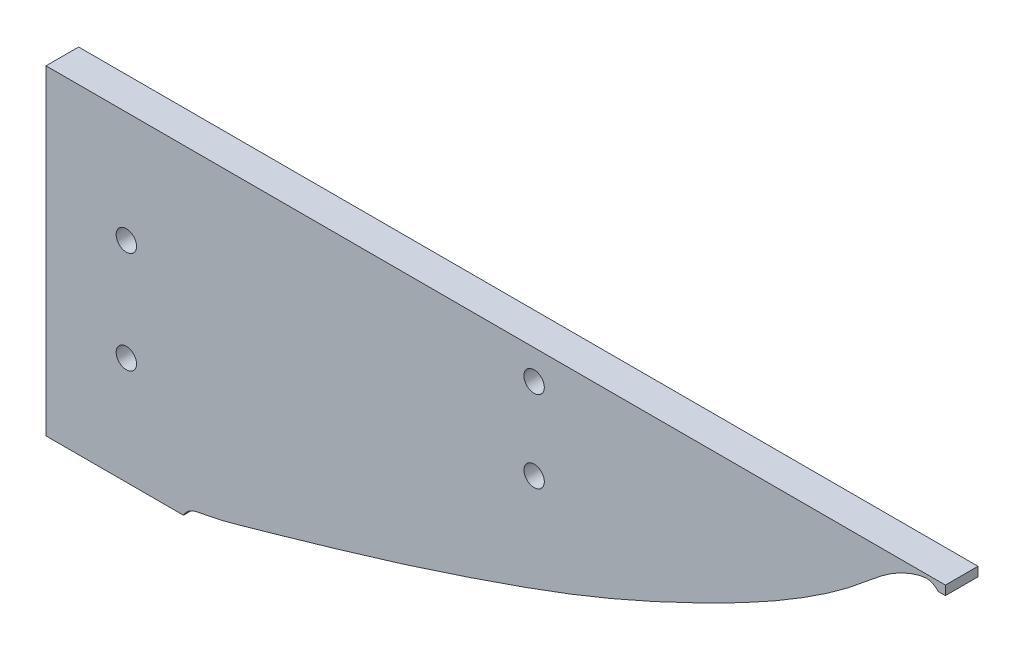
ISO-10303-21;
HEADER;
FILE_DESCRIPTION(('STEP AP214'),'2;1');
FILE_NAME('part.step','',(''),(''),'','','');
FILE_SCHEMA(('AUTOMOTIVE_DESIGN { 1 0 10303 214 1 1 1 1 }'));
ENDSEC;
DATA;
#1=APPLICATION_CONTEXT('core data for automotive mechanical design processes');
#2=APPLICATION_PROTOCOL_DEFINITION('international standard','automotive_design',2000,#1);
#3=PRODUCT_CONTEXT('',#1,'mechanical');
#4=PRODUCT('Part','Part','',(#3));
#5=PRODUCT_RELATED_PRODUCT_CATEGORY('part','',(#4));
#6=PRODUCT_DEFINITION_FORMATION('','',#4);
#7=PRODUCT_DEFINITION_CONTEXT('part definition',#1,'design');
#8=PRODUCT_DEFINITION('design','',#6,#7);
#9=PRODUCT_DEFINITION_SHAPE('','',#8);
#10=(LENGTH_UNIT() NAMED_UNIT(*) SI_UNIT(.MILLI.,.METRE.));
#11=(NAMED_UNIT(*) PLANE_ANGLE_UNIT() SI_UNIT($,.RADIAN.));
#12=(NAMED_UNIT(*) SI_UNIT($,.STERADIAN.) SOLID_ANGLE_UNIT());
#13=UNCERTAINTY_MEASURE_WITH_UNIT(LENGTH_MEASURE(1.E-05),#10,'distance_accuracy_value','');
#14=(GEOMETRIC_REPRESENTATION_CONTEXT(3) GLOBAL_UNCERTAINTY_ASSIGNED_CONTEXT((#13)) GLOBAL_UNIT_ASSIGNED_CONTEXT((#10,
#11,#12)) REPRESENTATION_CONTEXT('',''));
#15=CARTESIAN_POINT('',(0.,0.,0.));
#16=DIRECTION('',(0.,0.,1.));
#17=DIRECTION('',(1.,0.,0.));
#18=AXIS2_PLACEMENT_3D('',#15,#16,#17);
#19=CARTESIAN_POINT('',(10.3256357349458,-45.1516392966903,196.));
#20=DIRECTION('',(0.,0.,-1.));
#21=DIRECTION('',(-1.,0.,0.));
#22=AXIS2_PLACEMENT_3D('',#19,#20,#21);
#23=PLANE('',#22);
#24=CARTESIAN_POINT('',(-100.,-50.,196.));
#25=DIRECTION('',(0.,0.,-1.));
#26=DIRECTION('',(-1.,0.,0.));
#27=AXIS2_PLACEMENT_3D('',#24,#25,#26);
#28=CIRCLE('',#27,2.5);
#29=CARTESIAN_POINT('',(-102.5,-50.,196.));
#30=VERTEX_POINT('',#29);
#31=EDGE_CURVE('E242',#30,#30,#28,.F.);
#32=ORIENTED_EDGE('',*,*,#31,.F.);
#33=EDGE_LOOP('',(#32));
#34=FACE_BOUND('',#33,.T.);
#35=CARTESIAN_POINT('',(0.0705666698621599,-4.96037406111782,196.));
#36=DIRECTION('',(0.,0.,-1.));
#37=DIRECTION('',(-1.,0.,0.));
#38=AXIS2_PLACEMENT_3D('',#35,#36,#37);
#39=CIRCLE('',#38,2.5);
#40=CARTESIAN_POINT('',(-2.42943333013784,-4.96037406111782,196.));
#41=VERTEX_POINT('',#40);
#42=EDGE_CURVE('E238',#41,#41,#39,.F.);
#43=ORIENTED_EDGE('',*,*,#42,.F.);
#44=EDGE_LOOP('',(#43));
#45=FACE_BOUND('',#44,.T.);
#46=CARTESIAN_POINT('',(99.251635557057,0.,196.));
#47=CARTESIAN_POINT('',(99.1943856729682,0.123648326559636,196.));
#48=CARTESIAN_POINT('',(99.0992051466861,0.222441664451722,196.));
#49=CARTESIAN_POINT('',(98.88779925621,0.390903810603125,196.));
#50=CARTESIAN_POINT('',(98.7749015728634,0.464517181887149,196.));
#51=CARTESIAN_POINT('',(98.4378864766115,0.687833551674184,196.));
#52=CARTESIAN_POINT('',(98.2181028428287,0.845032284207759,196.));
#53=CARTESIAN_POINT('',(97.8659498050294,1.04417970727211,196.));
#54=CARTESIAN_POINT('',(97.7465803277102,1.10546687413517,196.));
#55=CARTESIAN_POINT('',(97.5002795927652,1.20863211679734,196.));
#56=CARTESIAN_POINT('',(97.3729686971485,1.24953576223254,196.));
#57=CARTESIAN_POINT('',(97.1106353412148,1.31154950509656,196.));
#58=CARTESIAN_POINT('',(96.9758772850931,1.33257004813868,196.));
#59=CARTESIAN_POINT('',(96.7086383795153,1.35778813367215,196.));
#60=CARTESIAN_POINT('',(96.5749470230063,1.36231839060992,196.));
#61=CARTESIAN_POINT('',(96.1737194338919,1.35866037557109,196.));
#62=CARTESIAN_POINT('',(95.904904369617,1.33365977740502,196.));
#63=CARTESIAN_POINT('',(95.3726862807432,1.25975214958688,196.));
#64=CARTESIAN_POINT('',(95.1097914598335,1.21197721790005,196.));
#65=CARTESIAN_POINT('',(94.329334398215,1.0409537653978,196.));
#66=CARTESIAN_POINT('',(93.8201540516101,0.889486465605025,196.));
#67=CARTESIAN_POINT('',(92.3083743446097,0.382021909795812,196.));
#68=CARTESIAN_POINT('',(91.3175060663449,-0.0326311685803727,196.));
#69=CARTESIAN_POINT('',(89.4088725138591,-0.959529141363401,196.));
#70=CARTESIAN_POINT('',(88.4888416910653,-1.47537055579702,196.));
#71=CARTESIAN_POINT('',(85.8285950950597,-3.17546945890725,196.));
#72=CARTESIAN_POINT('',(84.1834037027236,-4.50495090248594,196.));
#73=CARTESIAN_POINT('',(81.7395002719513,-6.5356184996227,196.));
#74=CARTESIAN_POINT('',(80.9281284347027,-7.21710861052911,196.));
#75=CARTESIAN_POINT('',(79.2915155500253,-8.56053073829356,196.));
#76=CARTESIAN_POINT('',(78.467875587664,-9.22472057458932,196.));
#77=CARTESIAN_POINT('',(75.967597320388,-11.175889459111,196.));
#78=CARTESIAN_POINT('',(74.260164298545,-12.4194423884697,196.));
#79=CARTESIAN_POINT('',(70.7904042303176,-14.8291377471848,196.));
#80=CARTESIAN_POINT('',(69.0287031758022,-15.9961629382624,196.));
#81=CARTESIAN_POINT('',(65.4649462995145,-18.273305802032,196.));
#82=CARTESIAN_POINT('',(63.6617548055291,-19.3831819094058,196.));
#83=CARTESIAN_POINT('',(60.0170247578523,-21.5427350106698,196.));
#84=CARTESIAN_POINT('',(58.1776836393403,-22.5922573901154,196.));
#85=CARTESIAN_POINT('',(52.6200866810706,-25.6702979100167,196.));
#86=CARTESIAN_POINT('',(48.8635597656297,-27.63115711148,196.));
#87=CARTESIAN_POINT('',(41.2987812014237,-31.4393694513124,196.));
#88=CARTESIAN_POINT('',(37.4877270150567,-33.2851074543847,196.));
#89=CARTESIAN_POINT('',(29.8165916860188,-36.8767535940467,196.));
#90=CARTESIAN_POINT('',(25.9572219155773,-38.6242634825712,196.));
#91=CARTESIAN_POINT('',(18.184054915091,-41.9918031831548,196.));
#92=CARTESIAN_POINT('',(14.2680314736562,-43.6076679626244,196.));
#93=CARTESIAN_POINT('',(6.38323999623536,-46.6956106307564,196.));
#94=CARTESIAN_POINT('',(2.41392602640405,-48.1694567970777,196.));
#95=CARTESIAN_POINT('',(-5.55901118374431,-51.0277694324738,196.));
#96=CARTESIAN_POINT('',(-9.56081886453918,-52.4154384506347,196.));
#97=CARTESIAN_POINT('',(-17.5802287854078,-55.1406407334949,196.));
#98=CARTESIAN_POINT('',(-21.5989248159709,-56.4765703016071,196.));
#99=CARTESIAN_POINT('',(-29.6582627540269,-59.083328058664,196.));
#100=CARTESIAN_POINT('',(-33.6988265171787,-60.3526565972465,196.));
#101=CARTESIAN_POINT('',(-41.7990104102397,-62.8272722178136,196.));
#102=CARTESIAN_POINT('',(-45.8587681150004,-64.0328619953257,196.));
#103=CARTESIAN_POINT('',(-53.9886159292748,-66.410135927557,196.));
#104=CARTESIAN_POINT('',(-58.0577909663387,-67.5843134945257,196.));
#105=CARTESIAN_POINT('',(-64.1633379518027,-69.3392248824098,196.));
#106=CARTESIAN_POINT('',(-66.1986093525408,-69.9238844838721,196.));
#107=CARTESIAN_POINT('',(-69.2543647576475,-70.7908439842847,196.));
#108=CARTESIAN_POINT('',(-70.2734404023846,-71.0781035637509,196.));
#109=CARTESIAN_POINT('',(-72.3122873296289,-71.6501736146615,196.));
#110=CARTESIAN_POINT('',(-73.3313212401896,-71.9379390105839,196.));
#111=CARTESIAN_POINT('',(-75.3742444637338,-72.493997776713,196.));
#112=CARTESIAN_POINT('',(-76.3990031733629,-72.7588615333613,196.));
#113=CARTESIAN_POINT('',(-77.9481060728648,-73.10838044003,196.));
#114=CARTESIAN_POINT('',(-78.4664823626968,-73.21725406869,196.));
#115=CARTESIAN_POINT('',(-79.5069458552008,-73.4183145501416,196.));
#116=CARTESIAN_POINT('',(-80.0295556519695,-73.5073876365531,196.));
#117=CARTESIAN_POINT('',(-81.0758267214988,-73.6804679276332,196.));
#118=CARTESIAN_POINT('',(-81.5986906953239,-73.768316420312,196.));
#119=CARTESIAN_POINT('',(-82.3755570775236,-73.9358839530919,196.));
#120=CARTESIAN_POINT('',(-82.6333100551474,-73.9975332127773,196.));
#121=CARTESIAN_POINT('',(-83.144927633149,-74.1395654545076,196.));
#122=CARTESIAN_POINT('',(-83.4002989877075,-74.2210072021707,196.));
#123=CARTESIAN_POINT('',(-83.8954879689905,-74.4165904633735,196.));
#124=CARTESIAN_POINT('',(-84.1339426810428,-74.5301122740592,196.));
#125=CARTESIAN_POINT('',(-84.5843505220006,-74.8027669210532,196.));
#126=CARTESIAN_POINT('',(-84.7946567248478,-74.9658700838292,196.));
#127=CARTESIAN_POINT('',(-85.1909045490841,-75.3292556556998,196.));
#128=CARTESIAN_POINT('',(-85.3713398502371,-75.5281806578345,196.));
#129=CARTESIAN_POINT('',(-85.6388861245711,-75.8293423454681,196.));
#130=CARTESIAN_POINT('',(-85.7267195958422,-75.9307843809932,196.));
#131=CARTESIAN_POINT('',(-85.8830495283705,-76.1487926513225,196.));
#132=CARTESIAN_POINT('',(-85.9503177311373,-76.2681844057477,196.));
#133=CARTESIAN_POINT('',(-85.9778399820025,-76.4004965059826,196.));
#134=B_SPLINE_CURVE_WITH_KNOTS('',3,(#46,#47,#48,#49,#50,#51,#52,#53,#54,#55,#56,#57,#58,#59,
#60,#61,#62,#63,#64,#65,#66,#67,#68,#69,#70,#71,#72,#73,#74,#75,#76,#77,#78,#79,#80,#81,#82,#83,
#84,#85,#86,#87,#88,#89,#90,#91,#92,#93,#94,#95,#96,#97,#98,#99,#100,#101,#102,#103,#104,#105,
#106,#107,#108,#109,#110,#111,#112,#113,#114,#115,#116,#117,#118,#119,#120,#121,#122,#123,#124,
#125,#126,#127,#128,#129,#130,#131,#132,#133),.UNSPECIFIED.,.F.,.F.,(4,2,2,2,2,2,2,2,2,2,2,2,2,
2,2,2,2,2,2,2,2,2,2,2,2,2,2,2,2,2,2,2,2,2,2,2,2,2,2,2,2,2,2,4),(0.,0.001953125,0.00390625,
0.0078125,0.00976562500000011,0.0117187500000002,0.0136718750000002,0.0156250000000003,
0.0195312500000003,0.0234375000000003,0.0312500000000002,0.0468750000000003,0.0625000000000003,
0.0937500000000006,0.109375000000001,0.125000000000001,0.156250000000001,0.187500000000001,
0.218750000000001,0.250000000000001,0.312500000000001,0.375000000000001,0.4375,0.5,0.5625,0.625,
0.6875,0.75,0.8125,0.875,0.90625,0.921875,0.9375,0.953125,0.9609375,0.96875,0.9765625,
0.98046875,0.984375,0.98828125,0.9921875,0.99609375,0.998046875,1.),.UNSPECIFIED.);
#135=CARTESIAN_POINT('',(-85.9778399820026,-76.4004965059825,196.));
#136=VERTEX_POINT('',#135);
#137=CARTESIAN_POINT('',(99.2516355570567,0.,196.));
#138=VERTEX_POINT('',#137);
#139=EDGE_CURVE('E196',#136,#138,#134,.F.);
#140=ORIENTED_EDGE('',*,*,#139,.T.);
#141=DIRECTION('',(1.,0.,0.));
#142=VECTOR('',#141,1.);
#143=CARTESIAN_POINT('',(99.2516355570567,0.,196.));
#144=LINE('',#143,#142);
#145=CARTESIAN_POINT('',(101.006271731253,0.,196.));
#146=VERTEX_POINT('',#145);
#147=EDGE_CURVE('E90',#138,#146,#144,.T.);
#148=ORIENTED_EDGE('',*,*,#147,.T.);
#149=DIRECTION('',(0.,1.,0.));
#150=VECTOR('',#149,1.);
#151=CARTESIAN_POINT('',(101.006271731253,2.25600000000004,196.));
#152=LINE('',#151,#150);
#153=CARTESIAN_POINT('',(101.006271731253,2.25600000000004,196.));
#154=VERTEX_POINT('',#153);
#155=EDGE_CURVE('E103',#146,#154,#152,.T.);
#156=ORIENTED_EDGE('',*,*,#155,.T.);
#157=DIRECTION('',(-1.,0.,0.));
#158=VECTOR('',#157,1.);
#159=CARTESIAN_POINT('',(101.006271731253,2.25600000000004,196.));
#160=LINE('',#159,#158);
#161=CARTESIAN_POINT('',(-119.72189612588,2.25600000000002,196.));
#162=VERTEX_POINT('',#161);
#163=EDGE_CURVE('E97',#154,#162,#160,.T.);
#164=ORIENTED_EDGE('',*,*,#163,.T.);
#165=DIRECTION('',(0.,-1.,0.));
#166=VECTOR('',#165,1.);
#167=CARTESIAN_POINT('',(-119.72189612588,-76.414876598889,196.));
#168=LINE('',#167,#166);
#169=CARTESIAN_POINT('',(-119.72189612588,-76.414876598889,196.));
#170=VERTEX_POINT('',#169);
#171=EDGE_CURVE('E101',#162,#170,#168,.T.);
#172=ORIENTED_EDGE('',*,*,#171,.T.);
#173=CARTESIAN_POINT('',(-85.9778399820026,-76.4004965059825,196.));
#174=CARTESIAN_POINT('',(-97.2258577974012,-76.4076229836883,196.));
#175=CARTESIAN_POINT('',(-108.473876580364,-76.4122390416415,196.));
#176=CARTESIAN_POINT('',(-119.72189612588,-76.414876598889,196.));
#177=B_SPLINE_CURVE_WITH_KNOTS('',3,(#173,#174,#175,#176),.UNSPECIFIED.,.F.,.F.,(4,4),(0.,1.),.UNSPECIFIED.);
#178=EDGE_CURVE('E51',#170,#136,#177,.F.);
#179=ORIENTED_EDGE('',*,*,#178,.T.);
#180=EDGE_LOOP('',(#140,#148,#156,#164,#172,#179));
#181=FACE_BOUND('',#180,.T.);
#182=CARTESIAN_POINT('',(0.0705666698621599,-25.,196.));
#183=DIRECTION('',(0.,0.,-1.));
#184=DIRECTION('',(-1.,0.,0.));
#185=AXIS2_PLACEMENT_3D('',#182,#183,#184);
#186=CIRCLE('',#185,2.5);
#187=CARTESIAN_POINT('',(-2.42943333013784,-25.,196.));
#188=VERTEX_POINT('',#187);
#189=EDGE_CURVE('E239',#188,#188,#186,.F.);
#190=ORIENTED_EDGE('',*,*,#189,.F.);
#191=EDGE_LOOP('',(#190));
#192=FACE_BOUND('',#191,.T.);
#193=CARTESIAN_POINT('',(-100.,-25.,196.));
#194=DIRECTION('',(0.,0.,-1.));
#195=DIRECTION('',(-1.,0.,0.));
#196=AXIS2_PLACEMENT_3D('',#193,#194,#195);
#197=CIRCLE('',#196,2.5);
#198=CARTESIAN_POINT('',(-102.5,-25.,196.));
#199=VERTEX_POINT('',#198);
#200=EDGE_CURVE('E245',#199,#199,#197,.F.);
#201=ORIENTED_EDGE('',*,*,#200,.F.);
#202=EDGE_LOOP('',(#201));
#203=FACE_BOUND('',#202,.T.);
#204=ADVANCED_FACE('F30',(#34,#45,#181,#192,#203),#23,.F.);
#205=CARTESIAN_POINT('',(10.3256357349458,-45.1516392966903,188.));
#206=DIRECTION('',(0.,0.,-1.));
#207=DIRECTION('',(-1.,0.,0.));
#208=AXIS2_PLACEMENT_3D('',#205,#206,#207);
#209=PLANE('',#208);
#210=CARTESIAN_POINT('',(-100.,-50.,188.));
#211=DIRECTION('',(0.,0.,-1.));
#212=DIRECTION('',(-1.,0.,0.));
#213=AXIS2_PLACEMENT_3D('',#210,#211,#212);
#214=CIRCLE('',#213,2.5);
#215=CARTESIAN_POINT('',(-102.5,-50.,188.));
#216=VERTEX_POINT('',#215);
#217=EDGE_CURVE('E243',#216,#216,#214,.F.);
#218=ORIENTED_EDGE('',*,*,#217,.T.);
#219=EDGE_LOOP('',(#218));
#220=FACE_BOUND('',#219,.T.);
#221=CARTESIAN_POINT('',(0.0705666698621599,-4.96037406111782,188.));
#222=DIRECTION('',(0.,0.,-1.));
#223=DIRECTION('',(-1.,0.,0.));
#224=AXIS2_PLACEMENT_3D('',#221,#222,#223);
#225=CIRCLE('',#224,2.5);
#226=CARTESIAN_POINT('',(-2.42943333013784,-4.96037406111782,188.));
#227=VERTEX_POINT('',#226);
#228=EDGE_CURVE('E235',#227,#227,#225,.F.);
#229=ORIENTED_EDGE('',*,*,#228,.T.);
#230=EDGE_LOOP('',(#229));
#231=FACE_BOUND('',#230,.T.);
#232=CARTESIAN_POINT('',(-85.9778399820025,-76.4004965059826,188.));
#233=CARTESIAN_POINT('',(-85.9503177311373,-76.2681844057477,188.));
#234=CARTESIAN_POINT('',(-85.8830495283705,-76.1487926513225,188.));
#235=CARTESIAN_POINT('',(-85.7267195958422,-75.9307843809932,188.));
#236=CARTESIAN_POINT('',(-85.6388861245711,-75.8293423454681,188.));
#237=CARTESIAN_POINT('',(-85.3713398502371,-75.5281806578345,188.));
#238=CARTESIAN_POINT('',(-85.1909045490841,-75.3292556556998,188.));
#239=CARTESIAN_POINT('',(-84.7946567248478,-74.9658700838292,188.));
#240=CARTESIAN_POINT('',(-84.5843505220006,-74.8027669210532,188.));
#241=CARTESIAN_POINT('',(-84.1339426810428,-74.5301122740592,188.));
#242=CARTESIAN_POINT('',(-83.8954879689905,-74.4165904633735,188.));
#243=CARTESIAN_POINT('',(-83.4002989877075,-74.2210072021707,188.));
#244=CARTESIAN_POINT('',(-83.144927633149,-74.1395654545076,188.));
#245=CARTESIAN_POINT('',(-82.6333100551474,-73.9975332127773,188.));
#246=CARTESIAN_POINT('',(-82.3755570775236,-73.9358839530919,188.));
#247=CARTESIAN_POINT('',(-81.5986906953239,-73.768316420312,188.));
#248=CARTESIAN_POINT('',(-81.0758267214988,-73.6804679276332,188.));
#249=CARTESIAN_POINT('',(-80.0295556519695,-73.5073876365531,188.));
#250=CARTESIAN_POINT('',(-79.5069458552008,-73.4183145501416,188.));
#251=CARTESIAN_POINT('',(-78.4664823626968,-73.21725406869,188.));
#252=CARTESIAN_POINT('',(-77.9481060728648,-73.10838044003,188.));
#253=CARTESIAN_POINT('',(-76.3990031733629,-72.7588615333613,188.));
#254=CARTESIAN_POINT('',(-75.3742444637338,-72.493997776713,188.));
#255=CARTESIAN_POINT('',(-73.3313212401896,-71.9379390105839,188.));
#256=CARTESIAN_POINT('',(-72.3122873296289,-71.6501736146615,188.));
#257=CARTESIAN_POINT('',(-70.2734404023846,-71.0781035637509,188.));
#258=CARTESIAN_POINT('',(-69.2543647576475,-70.7908439842847,188.));
#259=CARTESIAN_POINT('',(-66.1986093525408,-69.9238844838721,188.));
#260=CARTESIAN_POINT('',(-64.1633379518027,-69.3392248824098,188.));
#261=CARTESIAN_POINT('',(-58.0577909663387,-67.5843134945257,188.));
#262=CARTESIAN_POINT('',(-53.9886159292748,-66.410135927557,188.));
#263=CARTESIAN_POINT('',(-45.8587681150004,-64.0328619953257,188.));
#264=CARTESIAN_POINT('',(-41.7990104102397,-62.8272722178136,188.));
#265=CARTESIAN_POINT('',(-33.6988265171787,-60.3526565972465,188.));
#266=CARTESIAN_POINT('',(-29.6582627540269,-59.083328058664,188.));
#267=CARTESIAN_POINT('',(-21.5989248159709,-56.4765703016071,188.));
#268=CARTESIAN_POINT('',(-17.5802287854078,-55.1406407334949,188.));
#269=CARTESIAN_POINT('',(-9.56081886453918,-52.4154384506347,188.));
#270=CARTESIAN_POINT('',(-5.55901118374431,-51.0277694324738,188.));
#271=CARTESIAN_POINT('',(2.41392602640405,-48.1694567970777,188.));
#272=CARTESIAN_POINT('',(6.38323999623536,-46.6956106307564,188.));
#273=CARTESIAN_POINT('',(14.2680314736562,-43.6076679626244,188.));
#274=CARTESIAN_POINT('',(18.184054915091,-41.9918031831548,188.));
#275=CARTESIAN_POINT('',(25.9572219155773,-38.6242634825712,188.));
#276=CARTESIAN_POINT('',(29.8165916860188,-36.8767535940467,188.));
#277=CARTESIAN_POINT('',(37.4877270150567,-33.2851074543847,188.));
#278=CARTESIAN_POINT('',(41.2987812014237,-31.4393694513124,188.));
#279=CARTESIAN_POINT('',(48.8635597656297,-27.63115711148,188.));
#280=CARTESIAN_POINT('',(52.6200866810706,-25.6702979100167,188.));
#281=CARTESIAN_POINT('',(58.1776836393403,-22.5922573901154,188.));
#282=CARTESIAN_POINT('',(60.0170247578523,-21.5427350106698,188.));
#283=CARTESIAN_POINT('',(63.6617548055291,-19.3831819094058,188.));
#284=CARTESIAN_POINT('',(65.4649462995145,-18.273305802032,188.));
#285=CARTESIAN_POINT('',(69.0287031758022,-15.9961629382624,188.));
#286=CARTESIAN_POINT('',(70.7904042303176,-14.8291377471848,188.));
#287=CARTESIAN_POINT('',(74.260164298545,-12.4194423884697,188.));
#288=CARTESIAN_POINT('',(75.967597320388,-11.175889459111,188.));
#289=CARTESIAN_POINT('',(78.467875587664,-9.22472057458932,188.));
#290=CARTESIAN_POINT('',(79.2915155500253,-8.56053073829356,188.));
#291=CARTESIAN_POINT('',(80.9281284347027,-7.21710861052911,188.));
#292=CARTESIAN_POINT('',(81.7395002719513,-6.5356184996227,188.));
#293=CARTESIAN_POINT('',(84.1834037027236,-4.50495090248594,188.));
#294=CARTESIAN_POINT('',(85.8285950950597,-3.17546945890725,188.));
#295=CARTESIAN_POINT('',(88.4888416910653,-1.47537055579702,188.));
#296=CARTESIAN_POINT('',(89.4088725138591,-0.959529141363401,188.));
#297=CARTESIAN_POINT('',(91.3175060663449,-0.0326311685803727,188.));
#298=CARTESIAN_POINT('',(92.3083743446097,0.382021909795812,188.));
#299=CARTESIAN_POINT('',(93.8201540516101,0.889486465605025,188.));
#300=CARTESIAN_POINT('',(94.329334398215,1.0409537653978,188.));
#301=CARTESIAN_POINT('',(95.1097914598335,1.21197721790005,188.));
#302=CARTESIAN_POINT('',(95.3726862807432,1.25975214958688,188.));
#303=CARTESIAN_POINT('',(95.904904369617,1.33365977740502,188.));
#304=CARTESIAN_POINT('',(96.1737194338919,1.35866037557109,188.));
#305=CARTESIAN_POINT('',(96.5749470230063,1.36231839060992,188.));
#306=CARTESIAN_POINT('',(96.7086383795153,1.35778813367215,188.));
#307=CARTESIAN_POINT('',(96.9758772850931,1.33257004813868,188.));
#308=CARTESIAN_POINT('',(97.1106353412148,1.31154950509656,188.));
#309=CARTESIAN_POINT('',(97.3729686971485,1.24953576223254,188.));
#310=CARTESIAN_POINT('',(97.5002795927652,1.20863211679734,188.));
#311=CARTESIAN_POINT('',(97.7465803277102,1.10546687413517,188.));
#312=CARTESIAN_POINT('',(97.8659498050294,1.04417970727211,188.));
#313=CARTESIAN_POINT('',(98.2181028428287,0.845032284207759,188.));
#314=CARTESIAN_POINT('',(98.4378864766115,0.687833551674184,188.));
#315=CARTESIAN_POINT('',(98.7749015728634,0.464517181887149,188.));
#316=CARTESIAN_POINT('',(98.88779925621,0.390903810603125,188.));
#317=CARTESIAN_POINT('',(99.0992051466861,0.222441664451722,188.));
#318=CARTESIAN_POINT('',(99.1943856729682,0.123648326559636,188.));
#319=CARTESIAN_POINT('',(99.251635557057,0.,188.));
#320=B_SPLINE_CURVE_WITH_KNOTS('',3,(#232,#233,#234,#235,#236,#237,#238,#239,#240,#241,#242,
#243,#244,#245,#246,#247,#248,#249,#250,#251,#252,#253,#254,#255,#256,#257,#258,#259,#260,#261,
#262,#263,#264,#265,#266,#267,#268,#269,#270,#271,#272,#273,#274,#275,#276,#277,#278,#279,#280,
#281,#282,#283,#284,#285,#286,#287,#288,#289,#290,#291,#292,#293,#294,#295,#296,#297,#298,#299,
#300,#301,#302,#303,#304,#305,#306,#307,#308,#309,#310,#311,#312,#313,#314,#315,#316,#317,#318,
#319),.UNSPECIFIED.,.F.,.F.,(4,2,2,2,2,2,2,2,2,2,2,2,2,2,2,2,2,2,2,2,2,2,2,2,2,2,2,2,2,2,2,2,2,
2,2,2,2,2,2,2,2,2,2,4),(0.,0.00195312500000022,0.00390625000000033,0.00781250000000033,
0.0117187500000003,0.0156250000000003,0.0195312500000003,0.0234375000000003,0.0312500000000002,
0.0390625000000001,0.046875,0.0625,0.0781249999999999,0.0937499999999999,0.125,0.1875,0.25,
0.3125,0.375,0.4375,0.5,0.5625,0.624999999999999,0.687499999999999,0.749999999999999,
0.781249999999999,0.812499999999999,0.843749999999999,0.874999999999999,0.890624999999999,
0.906249999999999,0.9375,0.953125,0.96875,0.9765625,0.98046875,0.984375,0.986328125,0.98828125,
0.990234375,0.9921875,0.99609375,0.998046875,1.),.UNSPECIFIED.);
#321=CARTESIAN_POINT('',(-85.9778399820026,-76.4004965059825,188.));
#322=VERTEX_POINT('',#321);
#323=CARTESIAN_POINT('',(99.2516355570567,0.,188.));
#324=VERTEX_POINT('',#323);
#325=EDGE_CURVE('E213',#322,#324,#320,.T.);
#326=ORIENTED_EDGE('',*,*,#325,.F.);
#327=CARTESIAN_POINT('',(-119.72189612588,-76.414876598889,188.));
#328=CARTESIAN_POINT('',(-108.473876580364,-76.4122390416415,188.));
#329=CARTESIAN_POINT('',(-97.2258577974012,-76.4076229836883,188.));
#330=CARTESIAN_POINT('',(-85.9778399820026,-76.4004965059825,188.));
#331=B_SPLINE_CURVE_WITH_KNOTS('',3,(#327,#328,#329,#330),.UNSPECIFIED.,.F.,.F.,(4,4),(0.,1.),.UNSPECIFIED.);
#332=CARTESIAN_POINT('',(-119.72189612588,-76.414876598889,188.));
#333=VERTEX_POINT('',#332);
#334=EDGE_CURVE('E81',#333,#322,#331,.T.);
#335=ORIENTED_EDGE('',*,*,#334,.F.);
#336=DIRECTION('',(0.,-1.,0.));
#337=VECTOR('',#336,1.);
#338=CARTESIAN_POINT('',(-119.72189612588,-76.414876598889,188.));
#339=LINE('',#338,#337);
#340=CARTESIAN_POINT('',(-119.72189612588,2.25600000000002,188.));
#341=VERTEX_POINT('',#340);
#342=EDGE_CURVE('E75',#341,#333,#339,.T.);
#343=ORIENTED_EDGE('',*,*,#342,.F.);
#344=DIRECTION('',(-1.,0.,0.));
#345=VECTOR('',#344,1.);
#346=CARTESIAN_POINT('',(101.006271731253,2.25600000000004,188.));
#347=LINE('',#346,#345);
#348=CARTESIAN_POINT('',(101.006271731253,2.25600000000004,188.));
#349=VERTEX_POINT('',#348);
#350=EDGE_CURVE('E111',#349,#341,#347,.T.);
#351=ORIENTED_EDGE('',*,*,#350,.F.);
#352=DIRECTION('',(0.,1.,0.));
#353=VECTOR('',#352,1.);
#354=CARTESIAN_POINT('',(101.006271731253,2.25600000000004,188.));
#355=LINE('',#354,#353);
#356=CARTESIAN_POINT('',(101.006271731253,0.,188.));
#357=VERTEX_POINT('',#356);
#358=EDGE_CURVE('E158',#357,#349,#355,.T.);
#359=ORIENTED_EDGE('',*,*,#358,.F.);
#360=DIRECTION('',(1.,0.,0.));
#361=VECTOR('',#360,1.);
#362=CARTESIAN_POINT('',(99.2516355570567,0.,188.));
#363=LINE('',#362,#361);
#364=EDGE_CURVE('E163',#324,#357,#363,.T.);
#365=ORIENTED_EDGE('',*,*,#364,.F.);
#366=EDGE_LOOP('',(#326,#335,#343,#351,#359,#365));
#367=FACE_BOUND('',#366,.T.);
#368=CARTESIAN_POINT('',(0.0705666698621599,-25.,188.));
#369=DIRECTION('',(0.,0.,-1.));
#370=DIRECTION('',(-1.,0.,0.));
#371=AXIS2_PLACEMENT_3D('',#368,#369,#370);
#372=CIRCLE('',#371,2.5);
#373=CARTESIAN_POINT('',(-2.42943333013784,-25.,188.));
#374=VERTEX_POINT('',#373);
#375=EDGE_CURVE('E240',#374,#374,#372,.F.);
#376=ORIENTED_EDGE('',*,*,#375,.T.);
#377=EDGE_LOOP('',(#376));
#378=FACE_BOUND('',#377,.T.);
#379=CARTESIAN_POINT('',(-100.,-25.,188.));
#380=DIRECTION('',(0.,0.,-1.));
#381=DIRECTION('',(-1.,0.,0.));
#382=AXIS2_PLACEMENT_3D('',#379,#380,#381);
#383=CIRCLE('',#382,2.5);
#384=CARTESIAN_POINT('',(-102.5,-25.,188.));
#385=VERTEX_POINT('',#384);
#386=EDGE_CURVE('E36',#385,#385,#383,.F.);
#387=ORIENTED_EDGE('',*,*,#386,.T.);
#388=EDGE_LOOP('',(#387));
#389=FACE_BOUND('',#388,.T.);
#390=ADVANCED_FACE('F148',(#220,#231,#367,#378,#389),#209,.T.);
#391=CARTESIAN_POINT('',(-85.9778399820025,-76.4004965059826,196.));
#392=CARTESIAN_POINT('',(-85.9503177311373,-76.2681844057477,196.));
#393=CARTESIAN_POINT('',(-85.8830495283705,-76.1487926513225,196.));
#394=CARTESIAN_POINT('',(-85.7267195958422,-75.9307843809932,196.));
#395=CARTESIAN_POINT('',(-85.6388861245711,-75.8293423454681,196.));
#396=CARTESIAN_POINT('',(-85.3713398502371,-75.5281806578345,196.));
#397=CARTESIAN_POINT('',(-85.1909045490841,-75.3292556556998,196.));
#398=CARTESIAN_POINT('',(-84.7946567248478,-74.9658700838292,196.));
#399=CARTESIAN_POINT('',(-84.5843505220006,-74.8027669210532,196.));
#400=CARTESIAN_POINT('',(-84.1339426810428,-74.5301122740592,196.));
#401=CARTESIAN_POINT('',(-83.8954879689905,-74.4165904633735,196.));
#402=CARTESIAN_POINT('',(-83.4002989877075,-74.2210072021707,196.));
#403=CARTESIAN_POINT('',(-83.144927633149,-74.1395654545076,196.));
#404=CARTESIAN_POINT('',(-82.6333100551474,-73.9975332127773,196.));
#405=CARTESIAN_POINT('',(-82.3755570775236,-73.9358839530919,196.));
#406=CARTESIAN_POINT('',(-81.5986906953239,-73.768316420312,196.));
#407=CARTESIAN_POINT('',(-81.0758267214988,-73.6804679276332,196.));
#408=CARTESIAN_POINT('',(-80.0295556519695,-73.5073876365531,196.));
#409=CARTESIAN_POINT('',(-79.5069458552008,-73.4183145501416,196.));
#410=CARTESIAN_POINT('',(-78.4664823626968,-73.21725406869,196.));
#411=CARTESIAN_POINT('',(-77.9481060728648,-73.10838044003,196.));
#412=CARTESIAN_POINT('',(-76.3990031733629,-72.7588615333613,196.));
#413=CARTESIAN_POINT('',(-75.3742444637338,-72.493997776713,196.));
#414=CARTESIAN_POINT('',(-73.3313212401896,-71.9379390105839,196.));
#415=CARTESIAN_POINT('',(-72.3122873296289,-71.6501736146615,196.));
#416=CARTESIAN_POINT('',(-70.2734404023846,-71.0781035637509,196.));
#417=CARTESIAN_POINT('',(-69.2543647576475,-70.7908439842847,196.));
#418=CARTESIAN_POINT('',(-66.1986093525408,-69.9238844838721,196.));
#419=CARTESIAN_POINT('',(-64.1633379518027,-69.3392248824098,196.));
#420=CARTESIAN_POINT('',(-58.0577909663387,-67.5843134945257,196.));
#421=CARTESIAN_POINT('',(-53.9886159292748,-66.410135927557,196.));
#422=CARTESIAN_POINT('',(-45.8587681150004,-64.0328619953257,196.));
#423=CARTESIAN_POINT('',(-41.7990104102397,-62.8272722178136,196.));
#424=CARTESIAN_POINT('',(-33.6988265171787,-60.3526565972465,196.));
#425=CARTESIAN_POINT('',(-29.6582627540269,-59.083328058664,196.));
#426=CARTESIAN_POINT('',(-21.5989248159709,-56.4765703016071,196.));
#427=CARTESIAN_POINT('',(-17.5802287854078,-55.1406407334949,196.));
#428=CARTESIAN_POINT('',(-9.56081886453918,-52.4154384506347,196.));
#429=CARTESIAN_POINT('',(-5.55901118374431,-51.0277694324738,196.));
#430=CARTESIAN_POINT('',(2.41392602640405,-48.1694567970777,196.));
#431=CARTESIAN_POINT('',(6.38323999623536,-46.6956106307564,196.));
#432=CARTESIAN_POINT('',(14.2680314736562,-43.6076679626244,196.));
#433=CARTESIAN_POINT('',(18.184054915091,-41.9918031831548,196.));
#434=CARTESIAN_POINT('',(25.9572219155773,-38.6242634825712,196.));
#435=CARTESIAN_POINT('',(29.8165916860188,-36.8767535940467,196.));
#436=CARTESIAN_POINT('',(37.4877270150567,-33.2851074543847,196.));
#437=CARTESIAN_POINT('',(41.2987812014237,-31.4393694513124,196.));
#438=CARTESIAN_POINT('',(48.8635597656297,-27.63115711148,196.));
#439=CARTESIAN_POINT('',(52.6200866810706,-25.6702979100167,196.));
#440=CARTESIAN_POINT('',(58.1776836393403,-22.5922573901154,196.));
#441=CARTESIAN_POINT('',(60.0170247578523,-21.5427350106698,196.));
#442=CARTESIAN_POINT('',(63.6617548055291,-19.3831819094058,196.));
#443=CARTESIAN_POINT('',(65.4649462995145,-18.273305802032,196.));
#444=CARTESIAN_POINT('',(69.0287031758022,-15.9961629382624,196.));
#445=CARTESIAN_POINT('',(70.7904042303176,-14.8291377471848,196.));
#446=CARTESIAN_POINT('',(74.260164298545,-12.4194423884697,196.));
#447=CARTESIAN_POINT('',(75.967597320388,-11.175889459111,196.));
#448=CARTESIAN_POINT('',(78.467875587664,-9.22472057458932,196.));
#449=CARTESIAN_POINT('',(79.2915155500253,-8.56053073829356,196.));
#450=CARTESIAN_POINT('',(80.9281284347027,-7.21710861052911,196.));
#451=CARTESIAN_POINT('',(81.7395002719513,-6.5356184996227,196.));
#452=CARTESIAN_POINT('',(84.1834037027236,-4.50495090248594,196.));
#453=CARTESIAN_POINT('',(85.8285950950597,-3.17546945890725,196.));
#454=CARTESIAN_POINT('',(88.4888416910653,-1.47537055579702,196.));
#455=CARTESIAN_POINT('',(89.4088725138591,-0.959529141363401,196.));
#456=CARTESIAN_POINT('',(91.3175060663449,-0.0326311685803727,196.));
#457=CARTESIAN_POINT('',(92.3083743446097,0.382021909795812,196.));
#458=CARTESIAN_POINT('',(93.8201540516101,0.889486465605025,196.));
#459=CARTESIAN_POINT('',(94.329334398215,1.0409537653978,196.));
#460=CARTESIAN_POINT('',(95.1097914598335,1.21197721790005,196.));
#461=CARTESIAN_POINT('',(95.3726862807432,1.25975214958688,196.));
#462=CARTESIAN_POINT('',(95.904904369617,1.33365977740502,196.));
#463=CARTESIAN_POINT('',(96.1737194338919,1.35866037557109,196.));
#464=CARTESIAN_POINT('',(96.5749470230063,1.36231839060992,196.));
#465=CARTESIAN_POINT('',(96.7086383795153,1.35778813367215,196.));
#466=CARTESIAN_POINT('',(96.9758772850931,1.33257004813868,196.));
#467=CARTESIAN_POINT('',(97.1106353412148,1.31154950509656,196.));
#468=CARTESIAN_POINT('',(97.3729686971485,1.24953576223254,196.));
#469=CARTESIAN_POINT('',(97.5002795927652,1.20863211679734,196.));
#470=CARTESIAN_POINT('',(97.7465803277102,1.10546687413517,196.));
#471=CARTESIAN_POINT('',(97.8659498050294,1.04417970727211,196.));
#472=CARTESIAN_POINT('',(98.2181028428287,0.845032284207759,196.));
#473=CARTESIAN_POINT('',(98.4378864766115,0.687833551674184,196.));
#474=CARTESIAN_POINT('',(98.7749015728634,0.464517181887149,196.));
#475=CARTESIAN_POINT('',(98.88779925621,0.390903810603125,196.));
#476=CARTESIAN_POINT('',(99.0992051466861,0.222441664451722,196.));
#477=CARTESIAN_POINT('',(99.1943856729682,0.123648326559636,196.));
#478=CARTESIAN_POINT('',(99.251635557057,0.,196.));
#479=B_SPLINE_CURVE_WITH_KNOTS('',3,(#391,#392,#393,#394,#395,#396,#397,#398,#399,#400,#401,
#402,#403,#404,#405,#406,#407,#408,#409,#410,#411,#412,#413,#414,#415,#416,#417,#418,#419,#420,
#421,#422,#423,#424,#425,#426,#427,#428,#429,#430,#431,#432,#433,#434,#435,#436,#437,#438,#439,
#440,#441,#442,#443,#444,#445,#446,#447,#448,#449,#450,#451,#452,#453,#454,#455,#456,#457,#458,
#459,#460,#461,#462,#463,#464,#465,#466,#467,#468,#469,#470,#471,#472,#473,#474,#475,#476,#477,
#478),.UNSPECIFIED.,.F.,.F.,(4,2,2,2,2,2,2,2,2,2,2,2,2,2,2,2,2,2,2,2,2,2,2,2,2,2,2,2,2,2,2,2,2,
2,2,2,2,2,2,2,2,2,2,4),(0.,0.00195312500000022,0.00390625000000033,0.00781250000000033,
0.0117187500000003,0.0156250000000003,0.0195312500000003,0.0234375000000003,0.0312500000000002,
0.0390625000000001,0.046875,0.0625,0.0781249999999999,0.0937499999999999,0.125,0.1875,0.25,
0.3125,0.375,0.4375,0.5,0.5625,0.624999999999999,0.687499999999999,0.749999999999999,
0.781249999999999,0.812499999999999,0.843749999999999,0.874999999999999,0.890624999999999,
0.906249999999999,0.9375,0.953125,0.96875,0.9765625,0.98046875,0.984375,0.986328125,0.98828125,
0.990234375,0.9921875,0.99609375,0.998046875,1.),.UNSPECIFIED.);
#480=DIRECTION('',(0.,0.,-1.));
#481=VECTOR('',#480,1.);
#482=SURFACE_OF_LINEAR_EXTRUSION('',#479,#481);
#483=ORIENTED_EDGE('',*,*,#325,.T.);
#484=DIRECTION('',(0.,0.,-1.));
#485=VECTOR('',#484,1.);
#486=CARTESIAN_POINT('',(99.2516355570567,0.,196.));
#487=LINE('',#486,#485);
#488=EDGE_CURVE('E11',#138,#324,#487,.T.);
#489=ORIENTED_EDGE('',*,*,#488,.F.);
#490=ORIENTED_EDGE('',*,*,#139,.F.);
#491=DIRECTION('',(0.,0.,-1.));
#492=VECTOR('',#491,1.);
#493=CARTESIAN_POINT('',(-85.9778399820026,-76.4004965059825,196.));
#494=LINE('',#493,#492);
#495=EDGE_CURVE('E117',#136,#322,#494,.T.);
#496=ORIENTED_EDGE('',*,*,#495,.T.);
#497=EDGE_LOOP('',(#483,#489,#490,#496));
#498=FACE_BOUND('',#497,.T.);
#499=ADVANCED_FACE('F32',(#498),#482,.F.);
#500=CARTESIAN_POINT('',(99.2516355570567,0.,196.));
#501=DIRECTION('',(0.,1.,0.));
#502=DIRECTION('',(-1.,0.,0.));
#503=AXIS2_PLACEMENT_3D('',#500,#501,#502);
#504=PLANE('',#503);
#505=ORIENTED_EDGE('',*,*,#364,.T.);
#506=DIRECTION('',(0.,0.,-1.));
#507=VECTOR('',#506,1.);
#508=CARTESIAN_POINT('',(101.006271731253,0.,196.));
#509=LINE('',#508,#507);
#510=EDGE_CURVE('E42',#146,#357,#509,.T.);
#511=ORIENTED_EDGE('',*,*,#510,.F.);
#512=ORIENTED_EDGE('',*,*,#147,.F.);
#513=ORIENTED_EDGE('',*,*,#488,.T.);
#514=EDGE_LOOP('',(#505,#511,#512,#513));
#515=FACE_BOUND('',#514,.T.);
#516=ADVANCED_FACE('F338',(#515),#504,.F.);
#517=CARTESIAN_POINT('',(101.006271731253,2.25600000000004,196.));
#518=DIRECTION('',(-1.,0.,0.));
#519=DIRECTION('',(0.,-1.,0.));
#520=AXIS2_PLACEMENT_3D('',#517,#518,#519);
#521=PLANE('',#520);
#522=ORIENTED_EDGE('',*,*,#358,.T.);
#523=DIRECTION('',(0.,0.,-1.));
#524=VECTOR('',#523,1.);
#525=CARTESIAN_POINT('',(101.006271731253,2.25600000000004,196.));
#526=LINE('',#525,#524);
#527=EDGE_CURVE('E112',#154,#349,#526,.T.);
#528=ORIENTED_EDGE('',*,*,#527,.F.);
#529=ORIENTED_EDGE('',*,*,#155,.F.);
#530=ORIENTED_EDGE('',*,*,#510,.T.);
#531=EDGE_LOOP('',(#522,#528,#529,#530));
#532=FACE_BOUND('',#531,.T.);
#533=ADVANCED_FACE('F330',(#532),#521,.F.);
#534=CARTESIAN_POINT('',(101.006271731253,2.25600000000004,196.));
#535=DIRECTION('',(0.,-1.,0.));
#536=DIRECTION('',(1.,0.,0.));
#537=AXIS2_PLACEMENT_3D('',#534,#535,#536);
#538=PLANE('',#537);
#539=ORIENTED_EDGE('',*,*,#350,.T.);
#540=DIRECTION('',(0.,0.,-1.));
#541=VECTOR('',#540,1.);
#542=CARTESIAN_POINT('',(-119.72189612588,2.25600000000002,196.));
#543=LINE('',#542,#541);
#544=EDGE_CURVE('E108',#162,#341,#543,.T.);
#545=ORIENTED_EDGE('',*,*,#544,.F.);
#546=ORIENTED_EDGE('',*,*,#163,.F.);
#547=ORIENTED_EDGE('',*,*,#527,.T.);
#548=EDGE_LOOP('',(#539,#545,#546,#547));
#549=FACE_BOUND('',#548,.T.);
#550=ADVANCED_FACE('F109',(#549),#538,.F.);
#551=CARTESIAN_POINT('',(-119.72189612588,-76.414876598889,196.));
#552=DIRECTION('',(1.,0.,0.));
#553=DIRECTION('',(0.,1.,0.));
#554=AXIS2_PLACEMENT_3D('',#551,#552,#553);
#555=PLANE('',#554);
#556=ORIENTED_EDGE('',*,*,#342,.T.);
#557=DIRECTION('',(0.,0.,-1.));
#558=VECTOR('',#557,1.);
#559=CARTESIAN_POINT('',(-119.72189612588,-76.414876598889,196.));
#560=LINE('',#559,#558);
#561=EDGE_CURVE('E113',#170,#333,#560,.T.);
#562=ORIENTED_EDGE('',*,*,#561,.F.);
#563=ORIENTED_EDGE('',*,*,#171,.F.);
#564=ORIENTED_EDGE('',*,*,#544,.T.);
#565=EDGE_LOOP('',(#556,#562,#563,#564));
#566=FACE_BOUND('',#565,.T.);
#567=ADVANCED_FACE('F115',(#566),#555,.F.);
#568=CARTESIAN_POINT('',(-119.72189612588,-76.414876598889,196.));
#569=CARTESIAN_POINT('',(-108.473876580364,-76.4122390416415,196.));
#570=CARTESIAN_POINT('',(-97.2258577974012,-76.4076229836883,196.));
#571=CARTESIAN_POINT('',(-85.9778399820026,-76.4004965059825,196.));
#572=B_SPLINE_CURVE_WITH_KNOTS('',3,(#568,#569,#570,#571),.UNSPECIFIED.,.F.,.F.,(4,4),(0.,1.),.UNSPECIFIED.);
#573=DIRECTION('',(0.,0.,-1.));
#574=VECTOR('',#573,1.);
#575=SURFACE_OF_LINEAR_EXTRUSION('',#572,#574);
#576=ORIENTED_EDGE('',*,*,#334,.T.);
#577=ORIENTED_EDGE('',*,*,#495,.F.);
#578=ORIENTED_EDGE('',*,*,#178,.F.);
#579=ORIENTED_EDGE('',*,*,#561,.T.);
#580=EDGE_LOOP('',(#576,#577,#578,#579));
#581=FACE_BOUND('',#580,.T.);
#582=ADVANCED_FACE('F136',(#581),#575,.F.);
#583=CARTESIAN_POINT('',(0.0705666698621599,-4.96037406111782,308.));
#584=DIRECTION('',(0.,0.,-1.));
#585=DIRECTION('',(-1.,0.,0.));
#586=AXIS2_PLACEMENT_3D('',#583,#584,#585);
#587=CYLINDRICAL_SURFACE('',#586,2.5);
#588=ORIENTED_EDGE('',*,*,#228,.F.);
#589=EDGE_LOOP('',(#588));
#590=FACE_BOUND('',#589,.T.);
#591=ORIENTED_EDGE('',*,*,#42,.T.);
#592=EDGE_LOOP('',(#591));
#593=FACE_BOUND('',#592,.T.);
#594=ADVANCED_FACE('F147',(#590,#593),#587,.F.);
#595=CARTESIAN_POINT('',(0.0705666698621599,-25.,308.));
#596=DIRECTION('',(0.,0.,-1.));
#597=DIRECTION('',(-1.,0.,0.));
#598=AXIS2_PLACEMENT_3D('',#595,#596,#597);
#599=CYLINDRICAL_SURFACE('',#598,2.5);
#600=ORIENTED_EDGE('',*,*,#375,.F.);
#601=EDGE_LOOP('',(#600));
#602=FACE_BOUND('',#601,.T.);
#603=ORIENTED_EDGE('',*,*,#189,.T.);
#604=EDGE_LOOP('',(#603));
#605=FACE_BOUND('',#604,.T.);
#606=ADVANCED_FACE('F269',(#602,#605),#599,.F.);
#607=CARTESIAN_POINT('',(-100.,-50.,308.));
#608=DIRECTION('',(0.,0.,-1.));
#609=DIRECTION('',(-1.,0.,0.));
#610=AXIS2_PLACEMENT_3D('',#607,#608,#609);
#611=CYLINDRICAL_SURFACE('',#610,2.5);
#612=ORIENTED_EDGE('',*,*,#217,.F.);
#613=EDGE_LOOP('',(#612));
#614=FACE_BOUND('',#613,.T.);
#615=ORIENTED_EDGE('',*,*,#31,.T.);
#616=EDGE_LOOP('',(#615));
#617=FACE_BOUND('',#616,.T.);
#618=ADVANCED_FACE('F274',(#614,#617),#611,.F.);
#619=CARTESIAN_POINT('',(-100.,-25.,308.));
#620=DIRECTION('',(0.,0.,-1.));
#621=DIRECTION('',(-1.,0.,0.));
#622=AXIS2_PLACEMENT_3D('',#619,#620,#621);
#623=CYLINDRICAL_SURFACE('',#622,2.5);
#624=ORIENTED_EDGE('',*,*,#386,.F.);
#625=EDGE_LOOP('',(#624));
#626=FACE_BOUND('',#625,.T.);
#627=ORIENTED_EDGE('',*,*,#200,.T.);
#628=EDGE_LOOP('',(#627));
#629=FACE_BOUND('',#628,.T.);
#630=ADVANCED_FACE('F284',(#626,#629),#623,.F.);
#631=CLOSED_SHELL('',(#204,#390,#499,#516,#533,#550,#567,#582,#594,#606,#618,#630));
#632=MANIFOLD_SOLID_BREP('B2',#631);
#633=ADVANCED_BREP_SHAPE_REPRESENTATION('',(#18,#632),#14);
#634=SHAPE_DEFINITION_REPRESENTATION(#9,#633);
ENDSEC;
END-ISO-10303-21;
